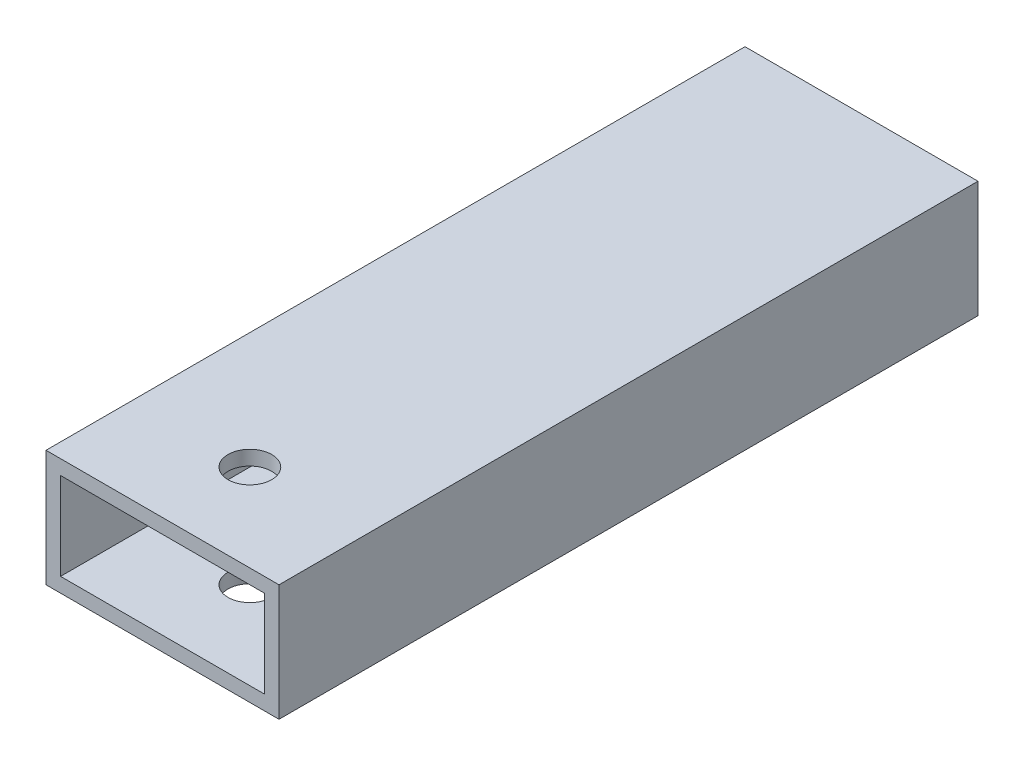
ISO-10303-21;
HEADER;
FILE_DESCRIPTION(('STEP AP214'),'2;1');
FILE_NAME('part.step','',(''),(''),'','','');
FILE_SCHEMA(('AUTOMOTIVE_DESIGN { 1 0 10303 214 1 1 1 1 }'));
ENDSEC;
DATA;
#1=APPLICATION_CONTEXT('core data for automotive mechanical design processes');
#2=APPLICATION_PROTOCOL_DEFINITION('international standard','automotive_design',2000,#1);
#3=PRODUCT_CONTEXT('',#1,'mechanical');
#4=PRODUCT('Part','Part','',(#3));
#5=PRODUCT_RELATED_PRODUCT_CATEGORY('part','',(#4));
#6=PRODUCT_DEFINITION_FORMATION('','',#4);
#7=PRODUCT_DEFINITION_CONTEXT('part definition',#1,'design');
#8=PRODUCT_DEFINITION('design','',#6,#7);
#9=PRODUCT_DEFINITION_SHAPE('','',#8);
#10=(LENGTH_UNIT() NAMED_UNIT(*) SI_UNIT(.MILLI.,.METRE.));
#11=(NAMED_UNIT(*) PLANE_ANGLE_UNIT() SI_UNIT($,.RADIAN.));
#12=(NAMED_UNIT(*) SI_UNIT($,.STERADIAN.) SOLID_ANGLE_UNIT());
#13=UNCERTAINTY_MEASURE_WITH_UNIT(LENGTH_MEASURE(1.E-05),#10,'distance_accuracy_value','');
#14=(GEOMETRIC_REPRESENTATION_CONTEXT(3) GLOBAL_UNCERTAINTY_ASSIGNED_CONTEXT((#13)) GLOBAL_UNIT_ASSIGNED_CONTEXT((#10,
#11,#12)) REPRESENTATION_CONTEXT('',''));
#15=CARTESIAN_POINT('',(0.,0.,0.));
#16=DIRECTION('',(0.,0.,1.));
#17=DIRECTION('',(1.,0.,0.));
#18=AXIS2_PLACEMENT_3D('',#15,#16,#17);
#19=CARTESIAN_POINT('',(0.,0.,152.4));
#20=DIRECTION('',(0.,0.,-1.));
#21=DIRECTION('',(-1.,0.,0.));
#22=AXIS2_PLACEMENT_3D('',#19,#20,#21);
#23=PLANE('',#22);
#24=DIRECTION('',(0.,1.,0.));
#25=VECTOR('',#24,1.);
#26=CARTESIAN_POINT('',(25.4,-12.7,152.4));
#27=LINE('',#26,#25);
#28=CARTESIAN_POINT('',(25.4,-12.7,152.4));
#29=VERTEX_POINT('',#28);
#30=CARTESIAN_POINT('',(25.4,12.7,152.4));
#31=VERTEX_POINT('',#30);
#32=EDGE_CURVE('E146',#29,#31,#27,.T.);
#33=ORIENTED_EDGE('',*,*,#32,.T.);
#34=DIRECTION('',(-1.,0.,0.));
#35=VECTOR('',#34,1.);
#36=CARTESIAN_POINT('',(-25.4,12.7,152.4));
#37=LINE('',#36,#35);
#38=CARTESIAN_POINT('',(-25.4,12.7,152.4));
#39=VERTEX_POINT('',#38);
#40=EDGE_CURVE('E149',#31,#39,#37,.T.);
#41=ORIENTED_EDGE('',*,*,#40,.T.);
#42=DIRECTION('',(0.,-1.,0.));
#43=VECTOR('',#42,1.);
#44=CARTESIAN_POINT('',(-25.4,-12.7,152.4));
#45=LINE('',#44,#43);
#46=CARTESIAN_POINT('',(-25.4,-12.7,152.4));
#47=VERTEX_POINT('',#46);
#48=EDGE_CURVE('E152',#39,#47,#45,.T.);
#49=ORIENTED_EDGE('',*,*,#48,.T.);
#50=DIRECTION('',(1.,0.,0.));
#51=VECTOR('',#50,1.);
#52=CARTESIAN_POINT('',(-25.4,-12.7,152.4));
#53=LINE('',#52,#51);
#54=EDGE_CURVE('E154',#47,#29,#53,.T.);
#55=ORIENTED_EDGE('',*,*,#54,.T.);
#56=EDGE_LOOP('',(#33,#41,#49,#55));
#57=FACE_BOUND('',#56,.T.);
#58=DIRECTION('',(0.,-1.,0.));
#59=VECTOR('',#58,1.);
#60=CARTESIAN_POINT('',(-22.225,-9.525,152.4));
#61=LINE('',#60,#59);
#62=CARTESIAN_POINT('',(-22.225,9.525,152.4));
#63=VERTEX_POINT('',#62);
#64=CARTESIAN_POINT('',(-22.225,-9.525,152.4));
#65=VERTEX_POINT('',#64);
#66=EDGE_CURVE('E106',#63,#65,#61,.T.);
#67=ORIENTED_EDGE('',*,*,#66,.F.);
#68=DIRECTION('',(-1.,0.,0.));
#69=VECTOR('',#68,1.);
#70=CARTESIAN_POINT('',(-22.225,9.525,152.4));
#71=LINE('',#70,#69);
#72=CARTESIAN_POINT('',(22.225,9.525,152.4));
#73=VERTEX_POINT('',#72);
#74=EDGE_CURVE('E128',#73,#63,#71,.T.);
#75=ORIENTED_EDGE('',*,*,#74,.F.);
#76=DIRECTION('',(0.,1.,0.));
#77=VECTOR('',#76,1.);
#78=CARTESIAN_POINT('',(22.225,-9.525,152.4));
#79=LINE('',#78,#77);
#80=CARTESIAN_POINT('',(22.225,-9.525,152.4));
#81=VERTEX_POINT('',#80);
#82=EDGE_CURVE('E126',#81,#73,#79,.T.);
#83=ORIENTED_EDGE('',*,*,#82,.F.);
#84=DIRECTION('',(1.,0.,0.));
#85=VECTOR('',#84,1.);
#86=CARTESIAN_POINT('',(-22.225,-9.525,152.4));
#87=LINE('',#86,#85);
#88=EDGE_CURVE('E114',#65,#81,#87,.T.);
#89=ORIENTED_EDGE('',*,*,#88,.F.);
#90=EDGE_LOOP('',(#67,#75,#83,#89));
#91=FACE_BOUND('',#90,.T.);
#92=ADVANCED_FACE('F39',(#57,#91),#23,.F.);
#93=CARTESIAN_POINT('',(0.,0.,0.));
#94=DIRECTION('',(0.,0.,-1.));
#95=DIRECTION('',(-1.,0.,0.));
#96=AXIS2_PLACEMENT_3D('',#93,#94,#95);
#97=PLANE('',#96);
#98=DIRECTION('',(0.,1.,0.));
#99=VECTOR('',#98,1.);
#100=CARTESIAN_POINT('',(25.4,-12.7,0.));
#101=LINE('',#100,#99);
#102=CARTESIAN_POINT('',(25.4,-12.7,0.));
#103=VERTEX_POINT('',#102);
#104=CARTESIAN_POINT('',(25.4,12.7,0.));
#105=VERTEX_POINT('',#104);
#106=EDGE_CURVE('E122',#103,#105,#101,.T.);
#107=ORIENTED_EDGE('',*,*,#106,.F.);
#108=DIRECTION('',(1.,0.,0.));
#109=VECTOR('',#108,1.);
#110=CARTESIAN_POINT('',(-25.4,-12.7,0.));
#111=LINE('',#110,#109);
#112=CARTESIAN_POINT('',(-25.4,-12.7,0.));
#113=VERTEX_POINT('',#112);
#114=EDGE_CURVE('E150',#113,#103,#111,.T.);
#115=ORIENTED_EDGE('',*,*,#114,.F.);
#116=DIRECTION('',(0.,-1.,0.));
#117=VECTOR('',#116,1.);
#118=CARTESIAN_POINT('',(-25.4,-12.7,0.));
#119=LINE('',#118,#117);
#120=CARTESIAN_POINT('',(-25.4,12.7,0.));
#121=VERTEX_POINT('',#120);
#122=EDGE_CURVE('E161',#121,#113,#119,.T.);
#123=ORIENTED_EDGE('',*,*,#122,.F.);
#124=DIRECTION('',(-1.,0.,0.));
#125=VECTOR('',#124,1.);
#126=CARTESIAN_POINT('',(-25.4,12.7,0.));
#127=LINE('',#126,#125);
#128=EDGE_CURVE('E159',#105,#121,#127,.T.);
#129=ORIENTED_EDGE('',*,*,#128,.F.);
#130=EDGE_LOOP('',(#107,#115,#123,#129));
#131=FACE_BOUND('',#130,.T.);
#132=DIRECTION('',(-1.,0.,0.));
#133=VECTOR('',#132,1.);
#134=CARTESIAN_POINT('',(-22.225,9.525,0.));
#135=LINE('',#134,#133);
#136=CARTESIAN_POINT('',(22.225,9.525,0.));
#137=VERTEX_POINT('',#136);
#138=CARTESIAN_POINT('',(-22.225,9.525,0.));
#139=VERTEX_POINT('',#138);
#140=EDGE_CURVE('E115',#137,#139,#135,.T.);
#141=ORIENTED_EDGE('',*,*,#140,.T.);
#142=DIRECTION('',(0.,-1.,0.));
#143=VECTOR('',#142,1.);
#144=CARTESIAN_POINT('',(-22.225,-9.525,0.));
#145=LINE('',#144,#143);
#146=CARTESIAN_POINT('',(-22.225,-9.525,0.));
#147=VERTEX_POINT('',#146);
#148=EDGE_CURVE('E64',#139,#147,#145,.T.);
#149=ORIENTED_EDGE('',*,*,#148,.T.);
#150=DIRECTION('',(1.,0.,0.));
#151=VECTOR('',#150,1.);
#152=CARTESIAN_POINT('',(-22.225,-9.525,0.));
#153=LINE('',#152,#151);
#154=CARTESIAN_POINT('',(22.225,-9.525,0.));
#155=VERTEX_POINT('',#154);
#156=EDGE_CURVE('E121',#147,#155,#153,.T.);
#157=ORIENTED_EDGE('',*,*,#156,.T.);
#158=DIRECTION('',(0.,1.,0.));
#159=VECTOR('',#158,1.);
#160=CARTESIAN_POINT('',(22.225,-9.525,0.));
#161=LINE('',#160,#159);
#162=EDGE_CURVE('E136',#155,#137,#161,.T.);
#163=ORIENTED_EDGE('',*,*,#162,.T.);
#164=EDGE_LOOP('',(#141,#149,#157,#163));
#165=FACE_BOUND('',#164,.T.);
#166=ADVANCED_FACE('F181',(#131,#165),#97,.T.);
#167=CARTESIAN_POINT('',(25.4,-12.7,152.4));
#168=DIRECTION('',(-1.,0.,0.));
#169=DIRECTION('',(0.,0.,1.));
#170=AXIS2_PLACEMENT_3D('',#167,#168,#169);
#171=PLANE('',#170);
#172=ORIENTED_EDGE('',*,*,#106,.T.);
#173=DIRECTION('',(0.,0.,-1.));
#174=VECTOR('',#173,1.);
#175=CARTESIAN_POINT('',(25.4,12.7,152.4));
#176=LINE('',#175,#174);
#177=EDGE_CURVE('E11',#31,#105,#176,.T.);
#178=ORIENTED_EDGE('',*,*,#177,.F.);
#179=ORIENTED_EDGE('',*,*,#32,.F.);
#180=DIRECTION('',(0.,0.,-1.));
#181=VECTOR('',#180,1.);
#182=CARTESIAN_POINT('',(25.4,-12.7,152.4));
#183=LINE('',#182,#181);
#184=EDGE_CURVE('E156',#29,#103,#183,.T.);
#185=ORIENTED_EDGE('',*,*,#184,.T.);
#186=EDGE_LOOP('',(#172,#178,#179,#185));
#187=FACE_BOUND('',#186,.T.);
#188=ADVANCED_FACE('F41',(#187),#171,.F.);
#189=CARTESIAN_POINT('',(-25.4,12.7,152.4));
#190=DIRECTION('',(0.,-1.,0.));
#191=DIRECTION('',(0.,0.,-1.));
#192=AXIS2_PLACEMENT_3D('',#189,#190,#191);
#193=PLANE('',#192);
#194=CARTESIAN_POINT('',(-1.28230759344206E-11,12.7,133.349999999998));
#195=DIRECTION('',(0.,1.,0.));
#196=DIRECTION('',(0.,0.,1.));
#197=AXIS2_PLACEMENT_3D('',#194,#195,#196);
#198=CIRCLE('',#197,4.76250000000002);
#199=CARTESIAN_POINT('',(-1.28230759344206E-11,12.7,138.112499999998));
#200=VERTEX_POINT('',#199);
#201=EDGE_CURVE('E219',#200,#200,#198,.T.);
#202=ORIENTED_EDGE('',*,*,#201,.F.);
#203=EDGE_LOOP('',(#202));
#204=FACE_BOUND('',#203,.T.);
#205=ORIENTED_EDGE('',*,*,#128,.T.);
#206=DIRECTION('',(0.,0.,-1.));
#207=VECTOR('',#206,1.);
#208=CARTESIAN_POINT('',(-25.4,12.7,152.4));
#209=LINE('',#208,#207);
#210=EDGE_CURVE('E49',#39,#121,#209,.T.);
#211=ORIENTED_EDGE('',*,*,#210,.F.);
#212=ORIENTED_EDGE('',*,*,#40,.F.);
#213=ORIENTED_EDGE('',*,*,#177,.T.);
#214=EDGE_LOOP('',(#205,#211,#212,#213));
#215=FACE_BOUND('',#214,.T.);
#216=ADVANCED_FACE('F191',(#204,#215),#193,.F.);
#217=CARTESIAN_POINT('',(-25.4,-12.7,152.4));
#218=DIRECTION('',(1.,0.,0.));
#219=DIRECTION('',(0.,0.,-1.));
#220=AXIS2_PLACEMENT_3D('',#217,#218,#219);
#221=PLANE('',#220);
#222=ORIENTED_EDGE('',*,*,#122,.T.);
#223=DIRECTION('',(0.,0.,-1.));
#224=VECTOR('',#223,1.);
#225=CARTESIAN_POINT('',(-25.4,-12.7,152.4));
#226=LINE('',#225,#224);
#227=EDGE_CURVE('E167',#47,#113,#226,.T.);
#228=ORIENTED_EDGE('',*,*,#227,.F.);
#229=ORIENTED_EDGE('',*,*,#48,.F.);
#230=ORIENTED_EDGE('',*,*,#210,.T.);
#231=EDGE_LOOP('',(#222,#228,#229,#230));
#232=FACE_BOUND('',#231,.T.);
#233=ADVANCED_FACE('F175',(#232),#221,.F.);
#234=CARTESIAN_POINT('',(-25.4,-12.7,152.4));
#235=DIRECTION('',(0.,1.,0.));
#236=DIRECTION('',(-1.,0.,0.));
#237=AXIS2_PLACEMENT_3D('',#234,#235,#236);
#238=PLANE('',#237);
#239=CARTESIAN_POINT('',(-1.28230759344206E-11,-12.7,133.349999999998));
#240=DIRECTION('',(0.,1.,0.));
#241=DIRECTION('',(0.,0.,1.));
#242=AXIS2_PLACEMENT_3D('',#239,#240,#241);
#243=CIRCLE('',#242,4.76250000000002);
#244=CARTESIAN_POINT('',(-1.28230759344206E-11,-12.7,138.112499999998));
#245=VERTEX_POINT('',#244);
#246=EDGE_CURVE('E217',#245,#245,#243,.T.);
#247=ORIENTED_EDGE('',*,*,#246,.T.);
#248=EDGE_LOOP('',(#247));
#249=FACE_BOUND('',#248,.T.);
#250=ORIENTED_EDGE('',*,*,#114,.T.);
#251=ORIENTED_EDGE('',*,*,#184,.F.);
#252=ORIENTED_EDGE('',*,*,#54,.F.);
#253=ORIENTED_EDGE('',*,*,#227,.T.);
#254=EDGE_LOOP('',(#250,#251,#252,#253));
#255=FACE_BOUND('',#254,.T.);
#256=ADVANCED_FACE('F185',(#249,#255),#238,.F.);
#257=CARTESIAN_POINT('',(-22.225,-9.525,152.4));
#258=DIRECTION('',(1.,0.,0.));
#259=DIRECTION('',(0.,0.,-1.));
#260=AXIS2_PLACEMENT_3D('',#257,#258,#259);
#261=PLANE('',#260);
#262=ORIENTED_EDGE('',*,*,#148,.F.);
#263=DIRECTION('',(0.,0.,-1.));
#264=VECTOR('',#263,1.);
#265=CARTESIAN_POINT('',(-22.225,9.525,152.4));
#266=LINE('',#265,#264);
#267=EDGE_CURVE('E110',#63,#139,#266,.T.);
#268=ORIENTED_EDGE('',*,*,#267,.F.);
#269=ORIENTED_EDGE('',*,*,#66,.T.);
#270=DIRECTION('',(0.,0.,-1.));
#271=VECTOR('',#270,1.);
#272=CARTESIAN_POINT('',(-22.225,-9.525,152.4));
#273=LINE('',#272,#271);
#274=EDGE_CURVE('E109',#65,#147,#273,.T.);
#275=ORIENTED_EDGE('',*,*,#274,.T.);
#276=EDGE_LOOP('',(#262,#268,#269,#275));
#277=FACE_BOUND('',#276,.T.);
#278=ADVANCED_FACE('F108',(#277),#261,.T.);
#279=CARTESIAN_POINT('',(-22.225,-9.525,152.4));
#280=DIRECTION('',(0.,1.,0.));
#281=DIRECTION('',(0.,0.,1.));
#282=AXIS2_PLACEMENT_3D('',#279,#280,#281);
#283=PLANE('',#282);
#284=CARTESIAN_POINT('',(-1.28230759344206E-11,-9.525,133.349999999998));
#285=DIRECTION('',(0.,1.,0.));
#286=DIRECTION('',(0.,0.,1.));
#287=AXIS2_PLACEMENT_3D('',#284,#285,#286);
#288=CIRCLE('',#287,4.76250000000002);
#289=CARTESIAN_POINT('',(-1.28230759344206E-11,-9.525,138.112499999998));
#290=VERTEX_POINT('',#289);
#291=EDGE_CURVE('E134',#290,#290,#288,.T.);
#292=ORIENTED_EDGE('',*,*,#291,.F.);
#293=EDGE_LOOP('',(#292));
#294=FACE_BOUND('',#293,.T.);
#295=ORIENTED_EDGE('',*,*,#156,.F.);
#296=ORIENTED_EDGE('',*,*,#274,.F.);
#297=ORIENTED_EDGE('',*,*,#88,.T.);
#298=DIRECTION('',(0.,0.,-1.));
#299=VECTOR('',#298,1.);
#300=CARTESIAN_POINT('',(22.225,-9.525,152.4));
#301=LINE('',#300,#299);
#302=EDGE_CURVE('E123',#81,#155,#301,.T.);
#303=ORIENTED_EDGE('',*,*,#302,.T.);
#304=EDGE_LOOP('',(#295,#296,#297,#303));
#305=FACE_BOUND('',#304,.T.);
#306=ADVANCED_FACE('F118',(#294,#305),#283,.T.);
#307=CARTESIAN_POINT('',(22.225,-9.525,152.4));
#308=DIRECTION('',(-1.,0.,0.));
#309=DIRECTION('',(0.,-1.,0.));
#310=AXIS2_PLACEMENT_3D('',#307,#308,#309);
#311=PLANE('',#310);
#312=ORIENTED_EDGE('',*,*,#162,.F.);
#313=ORIENTED_EDGE('',*,*,#302,.F.);
#314=ORIENTED_EDGE('',*,*,#82,.T.);
#315=DIRECTION('',(0.,0.,-1.));
#316=VECTOR('',#315,1.);
#317=CARTESIAN_POINT('',(22.225,9.525,152.4));
#318=LINE('',#317,#316);
#319=EDGE_CURVE('E56',#73,#137,#318,.T.);
#320=ORIENTED_EDGE('',*,*,#319,.T.);
#321=EDGE_LOOP('',(#312,#313,#314,#320));
#322=FACE_BOUND('',#321,.T.);
#323=ADVANCED_FACE('F230',(#322),#311,.T.);
#324=CARTESIAN_POINT('',(-22.225,9.525,152.4));
#325=DIRECTION('',(0.,-1.,0.));
#326=DIRECTION('',(0.,0.,-1.));
#327=AXIS2_PLACEMENT_3D('',#324,#325,#326);
#328=PLANE('',#327);
#329=CARTESIAN_POINT('',(-1.28230759344206E-11,9.525,133.349999999998));
#330=DIRECTION('',(0.,-1.,0.));
#331=DIRECTION('',(0.,0.,-1.));
#332=AXIS2_PLACEMENT_3D('',#329,#330,#331);
#333=CIRCLE('',#332,4.76250000000002);
#334=CARTESIAN_POINT('',(-1.28230759344206E-11,9.525,128.587499999998));
#335=VERTEX_POINT('',#334);
#336=EDGE_CURVE('E43',#335,#335,#333,.T.);
#337=ORIENTED_EDGE('',*,*,#336,.F.);
#338=EDGE_LOOP('',(#337));
#339=FACE_BOUND('',#338,.T.);
#340=ORIENTED_EDGE('',*,*,#140,.F.);
#341=ORIENTED_EDGE('',*,*,#319,.F.);
#342=ORIENTED_EDGE('',*,*,#74,.T.);
#343=ORIENTED_EDGE('',*,*,#267,.T.);
#344=EDGE_LOOP('',(#340,#341,#342,#343));
#345=FACE_BOUND('',#344,.T.);
#346=ADVANCED_FACE('F232',(#339,#345),#328,.T.);
#347=CARTESIAN_POINT('',(-1.28230759344206E-11,-12.7,133.349999999998));
#348=DIRECTION('',(0.,1.,0.));
#349=DIRECTION('',(0.,0.,1.));
#350=AXIS2_PLACEMENT_3D('',#347,#348,#349);
#351=CYLINDRICAL_SURFACE('',#350,4.76250000000002);
#352=ORIENTED_EDGE('',*,*,#336,.T.);
#353=EDGE_LOOP('',(#352));
#354=FACE_BOUND('',#353,.T.);
#355=ORIENTED_EDGE('',*,*,#201,.T.);
#356=EDGE_LOOP('',(#355));
#357=FACE_BOUND('',#356,.T.);
#358=ADVANCED_FACE('F238',(#354,#357),#351,.F.);
#359=ORIENTED_EDGE('',*,*,#291,.T.);
#360=EDGE_LOOP('',(#359));
#361=FACE_BOUND('',#360,.T.);
#362=ORIENTED_EDGE('',*,*,#246,.F.);
#363=EDGE_LOOP('',(#362));
#364=FACE_BOUND('',#363,.T.);
#365=ADVANCED_FACE('F227',(#361,#364),#351,.F.);
#366=CLOSED_SHELL('',(#92,#166,#188,#216,#233,#256,#278,#306,#323,#346,#358,#365));
#367=MANIFOLD_SOLID_BREP('B2',#366);
#368=ADVANCED_BREP_SHAPE_REPRESENTATION('',(#18,#367),#14);
#369=SHAPE_DEFINITION_REPRESENTATION(#9,#368);
ENDSEC;
END-ISO-10303-21;
